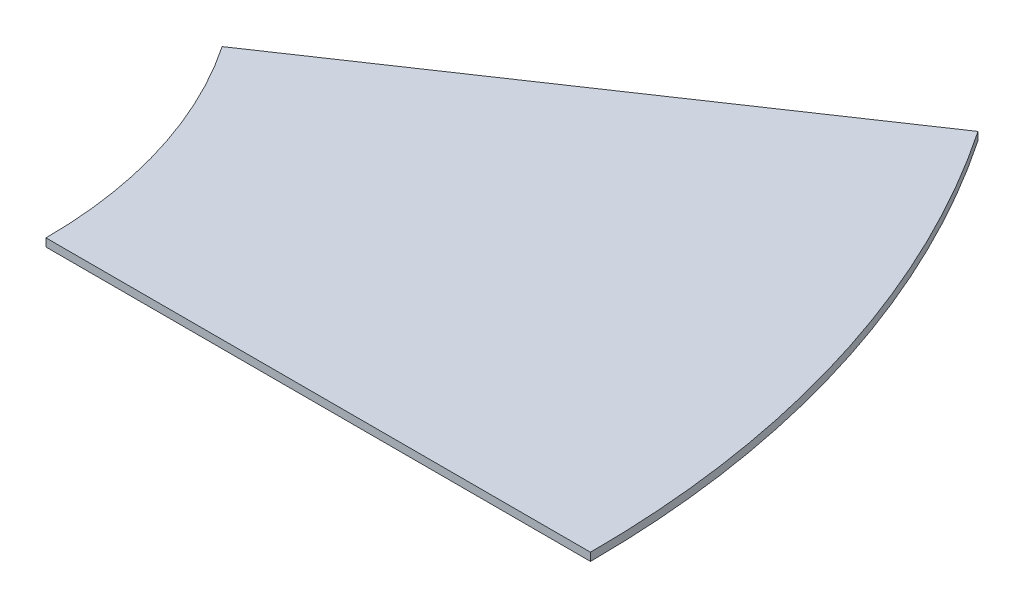
ISO-10303-21;
HEADER;
FILE_DESCRIPTION(('STEP AP214'),'2;1');
FILE_NAME('part.step','',(''),(''),'','','');
FILE_SCHEMA(('AUTOMOTIVE_DESIGN { 1 0 10303 214 1 1 1 1 }'));
ENDSEC;
DATA;
#1=APPLICATION_CONTEXT('core data for automotive mechanical design processes');
#2=APPLICATION_PROTOCOL_DEFINITION('international standard','automotive_design',2000,#1);
#3=PRODUCT_CONTEXT('',#1,'mechanical');
#4=PRODUCT('Part','Part','',(#3));
#5=PRODUCT_RELATED_PRODUCT_CATEGORY('part','',(#4));
#6=PRODUCT_DEFINITION_FORMATION('','',#4);
#7=PRODUCT_DEFINITION_CONTEXT('part definition',#1,'design');
#8=PRODUCT_DEFINITION('design','',#6,#7);
#9=PRODUCT_DEFINITION_SHAPE('','',#8);
#10=(LENGTH_UNIT() NAMED_UNIT(*) SI_UNIT(.MILLI.,.METRE.));
#11=(NAMED_UNIT(*) PLANE_ANGLE_UNIT() SI_UNIT($,.RADIAN.));
#12=(NAMED_UNIT(*) SI_UNIT($,.STERADIAN.) SOLID_ANGLE_UNIT());
#13=UNCERTAINTY_MEASURE_WITH_UNIT(LENGTH_MEASURE(1.E-05),#10,'distance_accuracy_value','');
#14=(GEOMETRIC_REPRESENTATION_CONTEXT(3) GLOBAL_UNCERTAINTY_ASSIGNED_CONTEXT((#13)) GLOBAL_UNIT_ASSIGNED_CONTEXT((#10,
#11,#12)) REPRESENTATION_CONTEXT('',''));
#15=CARTESIAN_POINT('',(0.,0.,0.));
#16=DIRECTION('',(0.,0.,1.));
#17=DIRECTION('',(1.,0.,0.));
#18=AXIS2_PLACEMENT_3D('',#15,#16,#17);
#19=CARTESIAN_POINT('',(0.,0.88,0.));
#20=DIRECTION('',(0.,-1.,0.));
#21=DIRECTION('',(0.,0.,-1.));
#22=AXIS2_PLACEMENT_3D('',#19,#20,#21);
#23=CYLINDRICAL_SURFACE('',#22,110.);
#24=CARTESIAN_POINT('',(0.,0.,0.));
#25=DIRECTION('',(0.,1.,0.));
#26=DIRECTION('',(0.,0.,1.));
#27=AXIS2_PLACEMENT_3D('',#24,#25,#26);
#28=CIRCLE('',#27,110.);
#29=CARTESIAN_POINT('',(110.,0.,0.));
#30=VERTEX_POINT('',#29);
#31=CARTESIAN_POINT('',(91.1941329810549,0.,-61.5112193817816));
#32=VERTEX_POINT('',#31);
#33=EDGE_CURVE('E97',#30,#32,#28,.T.);
#34=ORIENTED_EDGE('',*,*,#33,.T.);
#35=DIRECTION('',(0.,-1.,0.));
#36=VECTOR('',#35,1.);
#37=CARTESIAN_POINT('',(91.1941329810549,0.88,-61.5112193817816));
#38=LINE('',#37,#36);
#39=CARTESIAN_POINT('',(91.1941329810549,0.88,-61.5112193817816));
#40=VERTEX_POINT('',#39);
#41=EDGE_CURVE('E11',#40,#32,#38,.T.);
#42=ORIENTED_EDGE('',*,*,#41,.F.);
#43=CARTESIAN_POINT('',(0.,0.88,0.));
#44=DIRECTION('',(0.,1.,0.));
#45=DIRECTION('',(0.,0.,1.));
#46=AXIS2_PLACEMENT_3D('',#43,#44,#45);
#47=CIRCLE('',#46,110.);
#48=CARTESIAN_POINT('',(110.,0.88,0.));
#49=VERTEX_POINT('',#48);
#50=EDGE_CURVE('E83',#49,#40,#47,.T.);
#51=ORIENTED_EDGE('',*,*,#50,.F.);
#52=DIRECTION('',(0.,-1.,0.));
#53=VECTOR('',#52,1.);
#54=CARTESIAN_POINT('',(110.,0.88,0.));
#55=LINE('',#54,#53);
#56=EDGE_CURVE('E50',#49,#30,#55,.T.);
#57=ORIENTED_EDGE('',*,*,#56,.T.);
#58=EDGE_LOOP('',(#34,#42,#51,#57));
#59=FACE_BOUND('',#58,.T.);
#60=ADVANCED_FACE('F34',(#59),#23,.T.);
#61=CARTESIAN_POINT('',(91.1941329810549,0.88,-61.5112193817816));
#62=DIRECTION('',(0.559192903470742,0.,0.829037572555045));
#63=DIRECTION('',(0.829037572555045,0.,-0.559192903470742));
#64=AXIS2_PLACEMENT_3D('',#61,#62,#63);
#65=PLANE('',#64);
#66=DIRECTION('',(-0.829037572555045,0.,0.559192903470742));
#67=VECTOR('',#66,1.);
#68=CARTESIAN_POINT('',(91.1941329810549,0.,-61.5112193817816));
#69=LINE('',#68,#67);
#70=CARTESIAN_POINT('',(41.4518786277522,0.,-27.9596451735371));
#71=VERTEX_POINT('',#70);
#72=EDGE_CURVE('E88',#32,#71,#69,.T.);
#73=ORIENTED_EDGE('',*,*,#72,.T.);
#74=DIRECTION('',(0.,-1.,0.));
#75=VECTOR('',#74,1.);
#76=CARTESIAN_POINT('',(41.4518786277522,0.88,-27.9596451735371));
#77=LINE('',#76,#75);
#78=CARTESIAN_POINT('',(41.4518786277522,0.88,-27.9596451735371));
#79=VERTEX_POINT('',#78);
#80=EDGE_CURVE('E42',#79,#71,#77,.T.);
#81=ORIENTED_EDGE('',*,*,#80,.F.);
#82=DIRECTION('',(-0.829037572555045,0.,0.559192903470742));
#83=VECTOR('',#82,1.);
#84=CARTESIAN_POINT('',(91.1941329810549,0.88,-61.5112193817816));
#85=LINE('',#84,#83);
#86=EDGE_CURVE('E75',#40,#79,#85,.T.);
#87=ORIENTED_EDGE('',*,*,#86,.F.);
#88=ORIENTED_EDGE('',*,*,#41,.T.);
#89=EDGE_LOOP('',(#73,#81,#87,#88));
#90=FACE_BOUND('',#89,.T.);
#91=ADVANCED_FACE('F87',(#90),#65,.F.);
#92=CARTESIAN_POINT('',(0.,0.88,0.));
#93=DIRECTION('',(0.,-1.,0.));
#94=DIRECTION('',(0.,0.,-1.));
#95=AXIS2_PLACEMENT_3D('',#92,#93,#94);
#96=CYLINDRICAL_SURFACE('',#95,50.);
#97=CARTESIAN_POINT('',(0.,0.,0.));
#98=DIRECTION('',(0.,1.,0.));
#99=DIRECTION('',(0.,0.,1.));
#100=AXIS2_PLACEMENT_3D('',#97,#98,#99);
#101=CIRCLE('',#100,50.);
#102=CARTESIAN_POINT('',(50.,0.,0.));
#103=VERTEX_POINT('',#102);
#104=EDGE_CURVE('E100',#103,#71,#101,.T.);
#105=ORIENTED_EDGE('',*,*,#104,.F.);
#106=DIRECTION('',(0.,-1.,0.));
#107=VECTOR('',#106,1.);
#108=CARTESIAN_POINT('',(50.,0.88,0.));
#109=LINE('',#108,#107);
#110=CARTESIAN_POINT('',(50.,0.88,0.));
#111=VERTEX_POINT('',#110);
#112=EDGE_CURVE('E64',#111,#103,#109,.T.);
#113=ORIENTED_EDGE('',*,*,#112,.F.);
#114=CARTESIAN_POINT('',(0.,0.88,0.));
#115=DIRECTION('',(0.,1.,0.));
#116=DIRECTION('',(0.,0.,1.));
#117=AXIS2_PLACEMENT_3D('',#114,#115,#116);
#118=CIRCLE('',#117,50.);
#119=EDGE_CURVE('E82',#111,#79,#118,.T.);
#120=ORIENTED_EDGE('',*,*,#119,.T.);
#121=ORIENTED_EDGE('',*,*,#80,.T.);
#122=EDGE_LOOP('',(#105,#113,#120,#121));
#123=FACE_BOUND('',#122,.T.);
#124=ADVANCED_FACE('F91',(#123),#96,.F.);
#125=CARTESIAN_POINT('',(110.,0.88,0.));
#126=DIRECTION('',(0.,0.,1.));
#127=DIRECTION('',(1.,0.,0.));
#128=AXIS2_PLACEMENT_3D('',#125,#126,#127);
#129=PLANE('',#128);
#130=DIRECTION('',(-1.,0.,0.));
#131=VECTOR('',#130,1.);
#132=CARTESIAN_POINT('',(110.,0.,0.));
#133=LINE('',#132,#131);
#134=EDGE_CURVE('E102',#30,#103,#133,.T.);
#135=ORIENTED_EDGE('',*,*,#134,.F.);
#136=ORIENTED_EDGE('',*,*,#56,.F.);
#137=DIRECTION('',(-1.,0.,0.));
#138=VECTOR('',#137,1.);
#139=CARTESIAN_POINT('',(110.,0.88,0.));
#140=LINE('',#139,#138);
#141=EDGE_CURVE('E92',#49,#111,#140,.T.);
#142=ORIENTED_EDGE('',*,*,#141,.T.);
#143=ORIENTED_EDGE('',*,*,#112,.T.);
#144=EDGE_LOOP('',(#135,#136,#142,#143));
#145=FACE_BOUND('',#144,.T.);
#146=ADVANCED_FACE('F108',(#145),#129,.T.);
#147=CARTESIAN_POINT('',(0.,0.88,0.));
#148=DIRECTION('',(0.,1.,0.));
#149=DIRECTION('',(0.,0.,1.));
#150=AXIS2_PLACEMENT_3D('',#147,#148,#149);
#151=PLANE('',#150);
#152=ORIENTED_EDGE('',*,*,#50,.T.);
#153=ORIENTED_EDGE('',*,*,#86,.T.);
#154=ORIENTED_EDGE('',*,*,#119,.F.);
#155=ORIENTED_EDGE('',*,*,#141,.F.);
#156=EDGE_LOOP('',(#152,#153,#154,#155));
#157=FACE_BOUND('',#156,.T.);
#158=ADVANCED_FACE('F79',(#157),#151,.T.);
#159=CARTESIAN_POINT('',(0.,0.,0.));
#160=DIRECTION('',(0.,1.,0.));
#161=DIRECTION('',(0.,0.,1.));
#162=AXIS2_PLACEMENT_3D('',#159,#160,#161);
#163=PLANE('',#162);
#164=ORIENTED_EDGE('',*,*,#33,.F.);
#165=ORIENTED_EDGE('',*,*,#134,.T.);
#166=ORIENTED_EDGE('',*,*,#104,.T.);
#167=ORIENTED_EDGE('',*,*,#72,.F.);
#168=EDGE_LOOP('',(#164,#165,#166,#167));
#169=FACE_BOUND('',#168,.T.);
#170=ADVANCED_FACE('F107',(#169),#163,.F.);
#171=CLOSED_SHELL('',(#60,#91,#124,#146,#158,#170));
#172=MANIFOLD_SOLID_BREP('B2',#171);
#173=ADVANCED_BREP_SHAPE_REPRESENTATION('',(#18,#172),#14);
#174=SHAPE_DEFINITION_REPRESENTATION(#9,#173);
ENDSEC;
END-ISO-10303-21;
